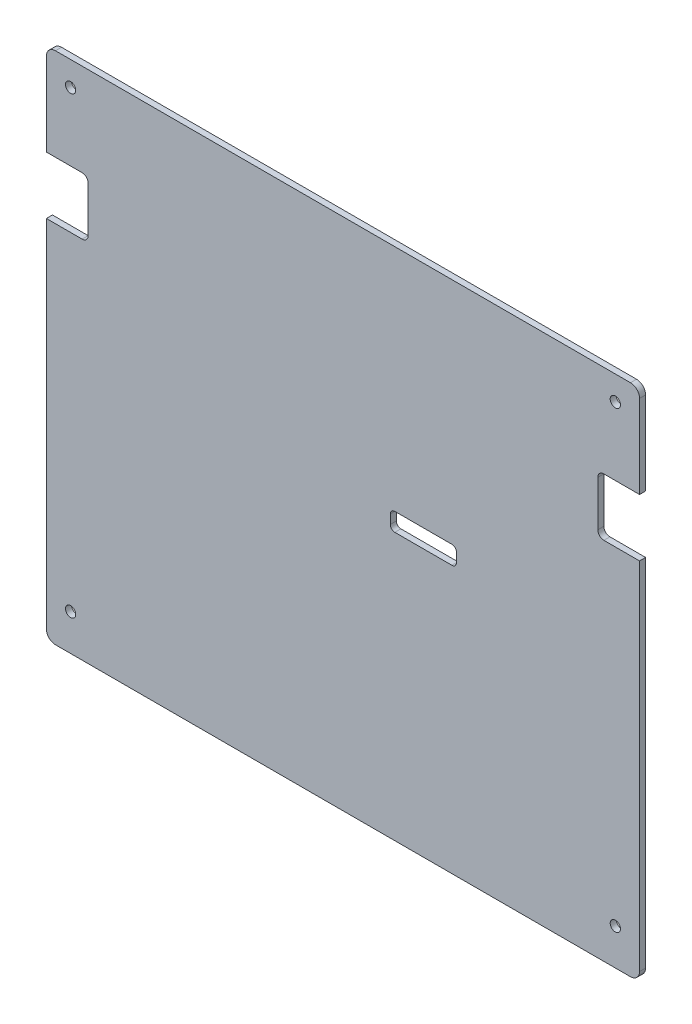
ISO-10303-21;
HEADER;
FILE_DESCRIPTION(('STEP AP214'),'2;1');
FILE_NAME('part.step','',(''),(''),'','','');
FILE_SCHEMA(('AUTOMOTIVE_DESIGN { 1 0 10303 214 1 1 1 1 }'));
ENDSEC;
DATA;
#1=APPLICATION_CONTEXT('core data for automotive mechanical design processes');
#2=APPLICATION_PROTOCOL_DEFINITION('international standard','automotive_design',2000,#1);
#3=PRODUCT_CONTEXT('',#1,'mechanical');
#4=PRODUCT('Part','Part','',(#3));
#5=PRODUCT_RELATED_PRODUCT_CATEGORY('part','',(#4));
#6=PRODUCT_DEFINITION_FORMATION('','',#4);
#7=PRODUCT_DEFINITION_CONTEXT('part definition',#1,'design');
#8=PRODUCT_DEFINITION('design','',#6,#7);
#9=PRODUCT_DEFINITION_SHAPE('','',#8);
#10=(LENGTH_UNIT() NAMED_UNIT(*) SI_UNIT(.MILLI.,.METRE.));
#11=(NAMED_UNIT(*) PLANE_ANGLE_UNIT() SI_UNIT($,.RADIAN.));
#12=(NAMED_UNIT(*) SI_UNIT($,.STERADIAN.) SOLID_ANGLE_UNIT());
#13=UNCERTAINTY_MEASURE_WITH_UNIT(LENGTH_MEASURE(1.E-05),#10,'distance_accuracy_value','');
#14=(GEOMETRIC_REPRESENTATION_CONTEXT(3) GLOBAL_UNCERTAINTY_ASSIGNED_CONTEXT((#13)) GLOBAL_UNIT_ASSIGNED_CONTEXT((#10,
#11,#12)) REPRESENTATION_CONTEXT('',''));
#15=CARTESIAN_POINT('',(0.,0.,0.));
#16=DIRECTION('',(0.,0.,1.));
#17=DIRECTION('',(1.,0.,0.));
#18=AXIS2_PLACEMENT_3D('',#15,#16,#17);
#19=CARTESIAN_POINT('',(193.,-4.,-10.));
#20=DIRECTION('',(-1.,0.,0.));
#21=DIRECTION('',(0.,0.,1.));
#22=AXIS2_PLACEMENT_3D('',#19,#20,#21);
#23=PLANE('',#22);
#24=DIRECTION('',(0.,1.,0.));
#25=VECTOR('',#24,1.);
#26=CARTESIAN_POINT('',(193.,-4.,-10.));
#27=LINE('',#26,#25);
#28=CARTESIAN_POINT('',(193.,132.5,-10.));
#29=VERTEX_POINT('',#28);
#30=CARTESIAN_POINT('',(193.,160.,-10.));
#31=VERTEX_POINT('',#30);
#32=EDGE_CURVE('E412',#29,#31,#27,.T.);
#33=ORIENTED_EDGE('',*,*,#32,.F.);
#34=DIRECTION('',(0.,0.,-1.));
#35=VECTOR('',#34,1.);
#36=CARTESIAN_POINT('',(193.,132.5,-10.));
#37=LINE('',#36,#35);
#38=CARTESIAN_POINT('',(193.,132.5,-12.));
#39=VERTEX_POINT('',#38);
#40=EDGE_CURVE('E471',#29,#39,#37,.T.);
#41=ORIENTED_EDGE('',*,*,#40,.T.);
#42=DIRECTION('',(0.,1.,0.));
#43=VECTOR('',#42,1.);
#44=CARTESIAN_POINT('',(193.,-4.,-12.));
#45=LINE('',#44,#43);
#46=CARTESIAN_POINT('',(193.,160.,-12.));
#47=VERTEX_POINT('',#46);
#48=EDGE_CURVE('E384',#39,#47,#45,.T.);
#49=ORIENTED_EDGE('',*,*,#48,.T.);
#50=DIRECTION('',(0.,0.,-1.));
#51=VECTOR('',#50,1.);
#52=CARTESIAN_POINT('',(193.,160.,-10.));
#53=LINE('',#52,#51);
#54=EDGE_CURVE('E344',#31,#47,#53,.T.);
#55=ORIENTED_EDGE('',*,*,#54,.F.);
#56=EDGE_LOOP('',(#33,#41,#49,#55));
#57=FACE_BOUND('',#56,.T.);
#58=ADVANCED_FACE('F45',(#57),#23,.F.);
#59=CARTESIAN_POINT('',(-3.,160.,-10.));
#60=DIRECTION('',(1.,0.,0.));
#61=DIRECTION('',(0.,0.,-1.));
#62=AXIS2_PLACEMENT_3D('',#59,#60,#61);
#63=PLANE('',#62);
#64=DIRECTION('',(0.,-1.,0.));
#65=VECTOR('',#64,1.);
#66=CARTESIAN_POINT('',(-3.,160.,-12.));
#67=LINE('',#66,#65);
#68=CARTESIAN_POINT('',(-3.,160.,-12.));
#69=VERTEX_POINT('',#68);
#70=CARTESIAN_POINT('',(-3.,132.5,-12.));
#71=VERTEX_POINT('',#70);
#72=EDGE_CURVE('E365',#69,#71,#67,.T.);
#73=ORIENTED_EDGE('',*,*,#72,.T.);
#74=DIRECTION('',(0.,0.,1.));
#75=VECTOR('',#74,1.);
#76=CARTESIAN_POINT('',(-3.,132.5,-10.));
#77=LINE('',#76,#75);
#78=CARTESIAN_POINT('',(-3.,132.5,-10.));
#79=VERTEX_POINT('',#78);
#80=EDGE_CURVE('E424',#71,#79,#77,.T.);
#81=ORIENTED_EDGE('',*,*,#80,.T.);
#82=DIRECTION('',(0.,-1.,0.));
#83=VECTOR('',#82,1.);
#84=CARTESIAN_POINT('',(-3.,160.,-10.));
#85=LINE('',#84,#83);
#86=CARTESIAN_POINT('',(-3.,160.,-10.));
#87=VERTEX_POINT('',#86);
#88=EDGE_CURVE('E364',#87,#79,#85,.T.);
#89=ORIENTED_EDGE('',*,*,#88,.F.);
#90=DIRECTION('',(0.,0.,-1.));
#91=VECTOR('',#90,1.);
#92=CARTESIAN_POINT('',(-3.,160.,-10.));
#93=LINE('',#92,#91);
#94=EDGE_CURVE('E356',#87,#69,#93,.T.);
#95=ORIENTED_EDGE('',*,*,#94,.T.);
#96=EDGE_LOOP('',(#73,#81,#89,#95));
#97=FACE_BOUND('',#96,.T.);
#98=ADVANCED_FACE('F589',(#97),#63,.F.);
#99=CARTESIAN_POINT('',(0.,-4.,-10.));
#100=DIRECTION('',(0.,0.,-1.));
#101=DIRECTION('',(-1.,0.,0.));
#102=AXIS2_PLACEMENT_3D('',#99,#100,#101);
#103=CYLINDRICAL_SURFACE('',#102,3.);
#104=CARTESIAN_POINT('',(0.,-4.,-12.));
#105=DIRECTION('',(0.,0.,1.));
#106=DIRECTION('',(1.,0.,0.));
#107=AXIS2_PLACEMENT_3D('',#104,#105,#106);
#108=CIRCLE('',#107,3.);
#109=CARTESIAN_POINT('',(-3.,-4.,-12.));
#110=VERTEX_POINT('',#109);
#111=CARTESIAN_POINT('',(0.,-7.,-12.));
#112=VERTEX_POINT('',#111);
#113=EDGE_CURVE('E391',#110,#112,#108,.T.);
#114=ORIENTED_EDGE('',*,*,#113,.T.);
#115=DIRECTION('',(0.,0.,-1.));
#116=VECTOR('',#115,1.);
#117=CARTESIAN_POINT('',(0.,-7.,-10.));
#118=LINE('',#117,#116);
#119=CARTESIAN_POINT('',(0.,-7.,-10.));
#120=VERTEX_POINT('',#119);
#121=EDGE_CURVE('E332',#120,#112,#118,.T.);
#122=ORIENTED_EDGE('',*,*,#121,.F.);
#123=CARTESIAN_POINT('',(0.,-4.,-10.));
#124=DIRECTION('',(0.,0.,1.));
#125=DIRECTION('',(1.,0.,0.));
#126=AXIS2_PLACEMENT_3D('',#123,#124,#125);
#127=CIRCLE('',#126,3.);
#128=CARTESIAN_POINT('',(-3.,-4.,-10.));
#129=VERTEX_POINT('',#128);
#130=EDGE_CURVE('E369',#129,#120,#127,.T.);
#131=ORIENTED_EDGE('',*,*,#130,.F.);
#132=DIRECTION('',(0.,0.,-1.));
#133=VECTOR('',#132,1.);
#134=CARTESIAN_POINT('',(-3.,-4.,-10.));
#135=LINE('',#134,#133);
#136=EDGE_CURVE('E360',#129,#110,#135,.T.);
#137=ORIENTED_EDGE('',*,*,#136,.T.);
#138=EDGE_LOOP('',(#114,#122,#131,#137));
#139=FACE_BOUND('',#138,.T.);
#140=ADVANCED_FACE('F47',(#139),#103,.T.);
#141=CARTESIAN_POINT('',(0.,-7.,-10.));
#142=DIRECTION('',(0.,1.,0.));
#143=DIRECTION('',(0.,0.,1.));
#144=AXIS2_PLACEMENT_3D('',#141,#142,#143);
#145=PLANE('',#144);
#146=DIRECTION('',(1.,0.,0.));
#147=VECTOR('',#146,1.);
#148=CARTESIAN_POINT('',(0.,-7.,-12.));
#149=LINE('',#148,#147);
#150=CARTESIAN_POINT('',(190.,-7.,-12.));
#151=VERTEX_POINT('',#150);
#152=EDGE_CURVE('E388',#112,#151,#149,.T.);
#153=ORIENTED_EDGE('',*,*,#152,.T.);
#154=DIRECTION('',(0.,0.,-1.));
#155=VECTOR('',#154,1.);
#156=CARTESIAN_POINT('',(190.,-7.,-10.));
#157=LINE('',#156,#155);
#158=CARTESIAN_POINT('',(190.,-7.,-10.));
#159=VERTEX_POINT('',#158);
#160=EDGE_CURVE('E336',#159,#151,#157,.T.);
#161=ORIENTED_EDGE('',*,*,#160,.F.);
#162=DIRECTION('',(1.,0.,0.));
#163=VECTOR('',#162,1.);
#164=CARTESIAN_POINT('',(0.,-7.,-10.));
#165=LINE('',#164,#163);
#166=EDGE_CURVE('E416',#120,#159,#165,.T.);
#167=ORIENTED_EDGE('',*,*,#166,.F.);
#168=ORIENTED_EDGE('',*,*,#121,.T.);
#169=EDGE_LOOP('',(#153,#161,#167,#168));
#170=FACE_BOUND('',#169,.T.);
#171=ADVANCED_FACE('F610',(#170),#145,.F.);
#172=CARTESIAN_POINT('',(190.,-4.,-10.));
#173=DIRECTION('',(0.,0.,-1.));
#174=DIRECTION('',(-1.,0.,0.));
#175=AXIS2_PLACEMENT_3D('',#172,#173,#174);
#176=CYLINDRICAL_SURFACE('',#175,3.);
#177=CARTESIAN_POINT('',(190.,-4.,-12.));
#178=DIRECTION('',(0.,0.,1.));
#179=DIRECTION('',(1.,0.,0.));
#180=AXIS2_PLACEMENT_3D('',#177,#178,#179);
#181=CIRCLE('',#180,3.);
#182=CARTESIAN_POINT('',(193.,-4.,-12.));
#183=VERTEX_POINT('',#182);
#184=EDGE_CURVE('E385',#151,#183,#181,.T.);
#185=ORIENTED_EDGE('',*,*,#184,.T.);
#186=DIRECTION('',(0.,0.,-1.));
#187=VECTOR('',#186,1.);
#188=CARTESIAN_POINT('',(193.,-4.,-10.));
#189=LINE('',#188,#187);
#190=CARTESIAN_POINT('',(193.,-4.,-10.));
#191=VERTEX_POINT('',#190);
#192=EDGE_CURVE('E340',#191,#183,#189,.T.);
#193=ORIENTED_EDGE('',*,*,#192,.F.);
#194=CARTESIAN_POINT('',(190.,-4.,-10.));
#195=DIRECTION('',(0.,0.,1.));
#196=DIRECTION('',(1.,0.,0.));
#197=AXIS2_PLACEMENT_3D('',#194,#195,#196);
#198=CIRCLE('',#197,3.);
#199=EDGE_CURVE('E413',#159,#191,#198,.T.);
#200=ORIENTED_EDGE('',*,*,#199,.F.);
#201=ORIENTED_EDGE('',*,*,#160,.T.);
#202=EDGE_LOOP('',(#185,#193,#200,#201));
#203=FACE_BOUND('',#202,.T.);
#204=ADVANCED_FACE('F603',(#203),#176,.T.);
#205=CARTESIAN_POINT('',(193.,113.5,-12.));
#206=VERTEX_POINT('',#205);
#207=EDGE_CURVE('E380',#183,#206,#45,.T.);
#208=ORIENTED_EDGE('',*,*,#207,.T.);
#209=DIRECTION('',(0.,0.,1.));
#210=VECTOR('',#209,1.);
#211=CARTESIAN_POINT('',(193.,113.5,-10.));
#212=LINE('',#211,#210);
#213=CARTESIAN_POINT('',(193.,113.5,-10.));
#214=VERTEX_POINT('',#213);
#215=EDGE_CURVE('E478',#206,#214,#212,.T.);
#216=ORIENTED_EDGE('',*,*,#215,.T.);
#217=EDGE_CURVE('E408',#191,#214,#27,.T.);
#218=ORIENTED_EDGE('',*,*,#217,.F.);
#219=ORIENTED_EDGE('',*,*,#192,.T.);
#220=EDGE_LOOP('',(#208,#216,#218,#219));
#221=FACE_BOUND('',#220,.T.);
#222=ADVANCED_FACE('F592',(#221),#23,.F.);
#223=CARTESIAN_POINT('',(190.,160.,-10.));
#224=DIRECTION('',(0.,0.,-1.));
#225=DIRECTION('',(-1.,0.,0.));
#226=AXIS2_PLACEMENT_3D('',#223,#224,#225);
#227=CYLINDRICAL_SURFACE('',#226,3.);
#228=CARTESIAN_POINT('',(190.,160.,-12.));
#229=DIRECTION('',(0.,0.,1.));
#230=DIRECTION('',(1.,0.,0.));
#231=AXIS2_PLACEMENT_3D('',#228,#229,#230);
#232=CIRCLE('',#231,3.);
#233=CARTESIAN_POINT('',(190.,163.,-12.));
#234=VERTEX_POINT('',#233);
#235=EDGE_CURVE('E377',#47,#234,#232,.T.);
#236=ORIENTED_EDGE('',*,*,#235,.T.);
#237=DIRECTION('',(0.,0.,-1.));
#238=VECTOR('',#237,1.);
#239=CARTESIAN_POINT('',(190.,163.,-10.));
#240=LINE('',#239,#238);
#241=CARTESIAN_POINT('',(190.,163.,-10.));
#242=VERTEX_POINT('',#241);
#243=EDGE_CURVE('E348',#242,#234,#240,.T.);
#244=ORIENTED_EDGE('',*,*,#243,.F.);
#245=CARTESIAN_POINT('',(190.,160.,-10.));
#246=DIRECTION('',(0.,0.,1.));
#247=DIRECTION('',(1.,0.,0.));
#248=AXIS2_PLACEMENT_3D('',#245,#246,#247);
#249=CIRCLE('',#248,3.);
#250=EDGE_CURVE('E405',#31,#242,#249,.T.);
#251=ORIENTED_EDGE('',*,*,#250,.F.);
#252=ORIENTED_EDGE('',*,*,#54,.T.);
#253=EDGE_LOOP('',(#236,#244,#251,#252));
#254=FACE_BOUND('',#253,.T.);
#255=ADVANCED_FACE('F602',(#254),#227,.T.);
#256=CARTESIAN_POINT('',(190.,163.,-10.));
#257=DIRECTION('',(0.,-1.,0.));
#258=DIRECTION('',(0.,0.,-1.));
#259=AXIS2_PLACEMENT_3D('',#256,#257,#258);
#260=PLANE('',#259);
#261=DIRECTION('',(-1.,0.,0.));
#262=VECTOR('',#261,1.);
#263=CARTESIAN_POINT('',(190.,163.,-12.));
#264=LINE('',#263,#262);
#265=CARTESIAN_POINT('',(0.,163.,-12.));
#266=VERTEX_POINT('',#265);
#267=EDGE_CURVE('E374',#234,#266,#264,.T.);
#268=ORIENTED_EDGE('',*,*,#267,.T.);
#269=DIRECTION('',(0.,0.,-1.));
#270=VECTOR('',#269,1.);
#271=CARTESIAN_POINT('',(0.,163.,-10.));
#272=LINE('',#271,#270);
#273=CARTESIAN_POINT('',(0.,163.,-10.));
#274=VERTEX_POINT('',#273);
#275=EDGE_CURVE('E352',#274,#266,#272,.T.);
#276=ORIENTED_EDGE('',*,*,#275,.F.);
#277=DIRECTION('',(-1.,0.,0.));
#278=VECTOR('',#277,1.);
#279=CARTESIAN_POINT('',(190.,163.,-10.));
#280=LINE('',#279,#278);
#281=EDGE_CURVE('E403',#242,#274,#280,.T.);
#282=ORIENTED_EDGE('',*,*,#281,.F.);
#283=ORIENTED_EDGE('',*,*,#243,.T.);
#284=EDGE_LOOP('',(#268,#276,#282,#283));
#285=FACE_BOUND('',#284,.T.);
#286=ADVANCED_FACE('F608',(#285),#260,.F.);
#287=CARTESIAN_POINT('',(0.,160.,-10.));
#288=DIRECTION('',(0.,0.,-1.));
#289=DIRECTION('',(-1.,0.,0.));
#290=AXIS2_PLACEMENT_3D('',#287,#288,#289);
#291=CYLINDRICAL_SURFACE('',#290,3.);
#292=CARTESIAN_POINT('',(0.,160.,-12.));
#293=DIRECTION('',(0.,0.,1.));
#294=DIRECTION('',(1.,0.,0.));
#295=AXIS2_PLACEMENT_3D('',#292,#293,#294);
#296=CIRCLE('',#295,3.);
#297=EDGE_CURVE('E371',#266,#69,#296,.T.);
#298=ORIENTED_EDGE('',*,*,#297,.T.);
#299=ORIENTED_EDGE('',*,*,#94,.F.);
#300=CARTESIAN_POINT('',(0.,160.,-10.));
#301=DIRECTION('',(0.,0.,1.));
#302=DIRECTION('',(1.,0.,0.));
#303=AXIS2_PLACEMENT_3D('',#300,#301,#302);
#304=CIRCLE('',#303,3.);
#305=EDGE_CURVE('E400',#274,#87,#304,.T.);
#306=ORIENTED_EDGE('',*,*,#305,.F.);
#307=ORIENTED_EDGE('',*,*,#275,.T.);
#308=EDGE_LOOP('',(#298,#299,#306,#307));
#309=FACE_BOUND('',#308,.T.);
#310=ADVANCED_FACE('F669',(#309),#291,.T.);
#311=CARTESIAN_POINT('',(-3.,113.5,-10.));
#312=VERTEX_POINT('',#311);
#313=EDGE_CURVE('E399',#312,#129,#85,.T.);
#314=ORIENTED_EDGE('',*,*,#313,.F.);
#315=DIRECTION('',(0.,0.,-1.));
#316=VECTOR('',#315,1.);
#317=CARTESIAN_POINT('',(-3.,113.5,-10.));
#318=LINE('',#317,#316);
#319=CARTESIAN_POINT('',(-3.,113.5,-12.));
#320=VERTEX_POINT('',#319);
#321=EDGE_CURVE('E440',#312,#320,#318,.T.);
#322=ORIENTED_EDGE('',*,*,#321,.T.);
#323=EDGE_CURVE('E370',#320,#110,#67,.T.);
#324=ORIENTED_EDGE('',*,*,#323,.T.);
#325=ORIENTED_EDGE('',*,*,#136,.F.);
#326=EDGE_LOOP('',(#314,#322,#324,#325));
#327=FACE_BOUND('',#326,.T.);
#328=ADVANCED_FACE('F597',(#327),#63,.F.);
#329=CARTESIAN_POINT('',(0.,-4.,-10.));
#330=DIRECTION('',(0.,0.,1.));
#331=DIRECTION('',(1.,0.,0.));
#332=AXIS2_PLACEMENT_3D('',#329,#330,#331);
#333=PLANE('',#332);
#334=CARTESIAN_POINT('',(112.12500058,82.74999704,-10.));
#335=DIRECTION('',(0.,0.,1.));
#336=DIRECTION('',(1.,0.,0.));
#337=AXIS2_PLACEMENT_3D('',#334,#335,#336);
#338=CIRCLE('',#337,1.5);
#339=CARTESIAN_POINT('',(110.62500058,82.74999704,-10.));
#340=VERTEX_POINT('',#339);
#341=CARTESIAN_POINT('',(112.12500058,81.24999704,-10.));
#342=VERTEX_POINT('',#341);
#343=EDGE_CURVE('E241',#340,#342,#338,.T.);
#344=ORIENTED_EDGE('',*,*,#343,.F.);
#345=DIRECTION('',(0.,-1.,0.));
#346=VECTOR('',#345,1.);
#347=CARTESIAN_POINT('',(110.62500058,-4.,-10.));
#348=LINE('',#347,#346);
#349=CARTESIAN_POINT('',(110.62500058,85.74999974,-10.));
#350=VERTEX_POINT('',#349);
#351=EDGE_CURVE('E512',#350,#340,#348,.T.);
#352=ORIENTED_EDGE('',*,*,#351,.F.);
#353=CARTESIAN_POINT('',(112.12500058,85.74999974,-10.));
#354=DIRECTION('',(0.,0.,1.));
#355=DIRECTION('',(1.,0.,0.));
#356=AXIS2_PLACEMENT_3D('',#353,#354,#355);
#357=CIRCLE('',#356,1.5);
#358=CARTESIAN_POINT('',(112.12500058,87.24999974,-10.));
#359=VERTEX_POINT('',#358);
#360=EDGE_CURVE('E515',#359,#350,#357,.T.);
#361=ORIENTED_EDGE('',*,*,#360,.F.);
#362=DIRECTION('',(-1.,0.,0.));
#363=VECTOR('',#362,1.);
#364=CARTESIAN_POINT('',(0.,87.24999974,-10.));
#365=LINE('',#364,#363);
#366=CARTESIAN_POINT('',(130.9999982,87.24999974,-10.));
#367=VERTEX_POINT('',#366);
#368=EDGE_CURVE('E518',#367,#359,#365,.T.);
#369=ORIENTED_EDGE('',*,*,#368,.F.);
#370=CARTESIAN_POINT('',(130.9999982,85.74999974,-10.));
#371=DIRECTION('',(0.,0.,1.));
#372=DIRECTION('',(1.,0.,0.));
#373=AXIS2_PLACEMENT_3D('',#370,#371,#372);
#374=CIRCLE('',#373,1.5);
#375=CARTESIAN_POINT('',(132.4999982,85.74999974,-10.));
#376=VERTEX_POINT('',#375);
#377=EDGE_CURVE('E521',#376,#367,#374,.T.);
#378=ORIENTED_EDGE('',*,*,#377,.F.);
#379=DIRECTION('',(0.,1.,0.));
#380=VECTOR('',#379,1.);
#381=CARTESIAN_POINT('',(132.4999982,-4.,-10.));
#382=LINE('',#381,#380);
#383=CARTESIAN_POINT('',(132.4999982,82.74999704,-10.));
#384=VERTEX_POINT('',#383);
#385=EDGE_CURVE('E524',#384,#376,#382,.T.);
#386=ORIENTED_EDGE('',*,*,#385,.F.);
#387=CARTESIAN_POINT('',(130.9999982,82.74999704,-10.));
#388=DIRECTION('',(0.,0.,1.));
#389=DIRECTION('',(1.,0.,0.));
#390=AXIS2_PLACEMENT_3D('',#387,#388,#389);
#391=CIRCLE('',#390,1.5);
#392=CARTESIAN_POINT('',(130.9999982,81.24999704,-10.));
#393=VERTEX_POINT('',#392);
#394=EDGE_CURVE('E527',#393,#384,#391,.T.);
#395=ORIENTED_EDGE('',*,*,#394,.F.);
#396=DIRECTION('',(1.,0.,0.));
#397=VECTOR('',#396,1.);
#398=CARTESIAN_POINT('',(0.,81.24999704,-10.));
#399=LINE('',#398,#397);
#400=EDGE_CURVE('E530',#342,#393,#399,.T.);
#401=ORIENTED_EDGE('',*,*,#400,.F.);
#402=EDGE_LOOP('',(#344,#352,#361,#369,#378,#386,#395,#401));
#403=FACE_BOUND('',#402,.T.);
#404=CARTESIAN_POINT('',(185.,155.,-10.));
#405=DIRECTION('',(0.,0.,1.));
#406=DIRECTION('',(1.,0.,0.));
#407=AXIS2_PLACEMENT_3D('',#404,#405,#406);
#408=CIRCLE('',#407,1.70000000000001);
#409=CARTESIAN_POINT('',(186.7,155.,-10.));
#410=VERTEX_POINT('',#409);
#411=EDGE_CURVE('E277',#410,#410,#408,.T.);
#412=ORIENTED_EDGE('',*,*,#411,.F.);
#413=EDGE_LOOP('',(#412));
#414=FACE_BOUND('',#413,.T.);
#415=CARTESIAN_POINT('',(5.,155.,-10.));
#416=DIRECTION('',(0.,0.,1.));
#417=DIRECTION('',(1.,0.,0.));
#418=AXIS2_PLACEMENT_3D('',#415,#416,#417);
#419=CIRCLE('',#418,1.7);
#420=CARTESIAN_POINT('',(6.7,155.,-10.));
#421=VERTEX_POINT('',#420);
#422=EDGE_CURVE('E282',#421,#421,#419,.T.);
#423=ORIENTED_EDGE('',*,*,#422,.F.);
#424=EDGE_LOOP('',(#423));
#425=FACE_BOUND('',#424,.T.);
#426=CARTESIAN_POINT('',(185.,5.,-10.));
#427=DIRECTION('',(0.,0.,1.));
#428=DIRECTION('',(1.,0.,0.));
#429=AXIS2_PLACEMENT_3D('',#426,#427,#428);
#430=CIRCLE('',#429,1.70000000000001);
#431=CARTESIAN_POINT('',(186.7,5.,-10.));
#432=VERTEX_POINT('',#431);
#433=EDGE_CURVE('E287',#432,#432,#430,.T.);
#434=ORIENTED_EDGE('',*,*,#433,.F.);
#435=EDGE_LOOP('',(#434));
#436=FACE_BOUND('',#435,.T.);
#437=CARTESIAN_POINT('',(5.,5.,-10.));
#438=DIRECTION('',(0.,0.,1.));
#439=DIRECTION('',(1.,0.,0.));
#440=AXIS2_PLACEMENT_3D('',#437,#438,#439);
#441=CIRCLE('',#440,1.7);
#442=CARTESIAN_POINT('',(6.7,5.,-10.));
#443=VERTEX_POINT('',#442);
#444=EDGE_CURVE('E292',#443,#443,#441,.T.);
#445=ORIENTED_EDGE('',*,*,#444,.F.);
#446=EDGE_LOOP('',(#445));
#447=FACE_BOUND('',#446,.T.);
#448=DIRECTION('',(-1.,0.,0.));
#449=VECTOR('',#448,1.);
#450=CARTESIAN_POINT('',(0.,132.5,-10.));
#451=LINE('',#450,#449);
#452=CARTESIAN_POINT('',(181.2,132.5,-10.));
#453=VERTEX_POINT('',#452);
#454=EDGE_CURVE('E468',#29,#453,#451,.T.);
#455=ORIENTED_EDGE('',*,*,#454,.F.);
#456=ORIENTED_EDGE('',*,*,#32,.T.);
#457=ORIENTED_EDGE('',*,*,#250,.T.);
#458=ORIENTED_EDGE('',*,*,#281,.T.);
#459=ORIENTED_EDGE('',*,*,#305,.T.);
#460=ORIENTED_EDGE('',*,*,#88,.T.);
#461=DIRECTION('',(-1.,0.,0.));
#462=VECTOR('',#461,1.);
#463=CARTESIAN_POINT('',(0.,132.5,-10.));
#464=LINE('',#463,#462);
#465=CARTESIAN_POINT('',(8.8,132.5,-10.));
#466=VERTEX_POINT('',#465);
#467=EDGE_CURVE('E395',#466,#79,#464,.T.);
#468=ORIENTED_EDGE('',*,*,#467,.F.);
#469=CARTESIAN_POINT('',(8.8,130.5,-10.));
#470=DIRECTION('',(0.,0.,1.));
#471=DIRECTION('',(1.,0.,0.));
#472=AXIS2_PLACEMENT_3D('',#469,#470,#471);
#473=CIRCLE('',#472,2.);
#474=CARTESIAN_POINT('',(10.8,130.5,-10.));
#475=VERTEX_POINT('',#474);
#476=EDGE_CURVE('E428',#475,#466,#473,.T.);
#477=ORIENTED_EDGE('',*,*,#476,.F.);
#478=DIRECTION('',(0.,1.,0.));
#479=VECTOR('',#478,1.);
#480=CARTESIAN_POINT('',(10.8,-4.,-10.));
#481=LINE('',#480,#479);
#482=CARTESIAN_POINT('',(10.8,115.5,-10.));
#483=VERTEX_POINT('',#482);
#484=EDGE_CURVE('E431',#483,#475,#481,.T.);
#485=ORIENTED_EDGE('',*,*,#484,.F.);
#486=CARTESIAN_POINT('',(8.8,115.5,-10.));
#487=DIRECTION('',(0.,0.,1.));
#488=DIRECTION('',(1.,0.,0.));
#489=AXIS2_PLACEMENT_3D('',#486,#487,#488);
#490=CIRCLE('',#489,2.);
#491=CARTESIAN_POINT('',(8.8,113.5,-10.));
#492=VERTEX_POINT('',#491);
#493=EDGE_CURVE('E434',#492,#483,#490,.T.);
#494=ORIENTED_EDGE('',*,*,#493,.F.);
#495=DIRECTION('',(1.,0.,0.));
#496=VECTOR('',#495,1.);
#497=CARTESIAN_POINT('',(0.,113.5,-10.));
#498=LINE('',#497,#496);
#499=EDGE_CURVE('E437',#312,#492,#498,.T.);
#500=ORIENTED_EDGE('',*,*,#499,.F.);
#501=ORIENTED_EDGE('',*,*,#313,.T.);
#502=ORIENTED_EDGE('',*,*,#130,.T.);
#503=ORIENTED_EDGE('',*,*,#166,.T.);
#504=ORIENTED_EDGE('',*,*,#199,.T.);
#505=ORIENTED_EDGE('',*,*,#217,.T.);
#506=DIRECTION('',(1.,0.,0.));
#507=VECTOR('',#506,1.);
#508=CARTESIAN_POINT('',(0.,113.5,-10.));
#509=LINE('',#508,#507);
#510=CARTESIAN_POINT('',(181.2,113.5,-10.));
#511=VERTEX_POINT('',#510);
#512=EDGE_CURVE('E475',#511,#214,#509,.T.);
#513=ORIENTED_EDGE('',*,*,#512,.F.);
#514=CARTESIAN_POINT('',(181.2,115.5,-10.));
#515=DIRECTION('',(0.,0.,1.));
#516=DIRECTION('',(1.,0.,0.));
#517=AXIS2_PLACEMENT_3D('',#514,#515,#516);
#518=CIRCLE('',#517,2.);
#519=CARTESIAN_POINT('',(179.2,115.5,-10.));
#520=VERTEX_POINT('',#519);
#521=EDGE_CURVE('E450',#520,#511,#518,.T.);
#522=ORIENTED_EDGE('',*,*,#521,.F.);
#523=DIRECTION('',(0.,-1.,0.));
#524=VECTOR('',#523,1.);
#525=CARTESIAN_POINT('',(179.2,-4.,-10.));
#526=LINE('',#525,#524);
#527=CARTESIAN_POINT('',(179.2,130.5,-10.));
#528=VERTEX_POINT('',#527);
#529=EDGE_CURVE('E462',#528,#520,#526,.T.);
#530=ORIENTED_EDGE('',*,*,#529,.F.);
#531=CARTESIAN_POINT('',(181.2,130.5,-10.));
#532=DIRECTION('',(0.,0.,1.));
#533=DIRECTION('',(1.,0.,0.));
#534=AXIS2_PLACEMENT_3D('',#531,#532,#533);
#535=CIRCLE('',#534,2.);
#536=EDGE_CURVE('E465',#453,#528,#535,.T.);
#537=ORIENTED_EDGE('',*,*,#536,.F.);
#538=EDGE_LOOP('',(#455,#456,#457,#458,#459,#460,#468,#477,#485,#494,#500,#501,#502,#503,#504,
#505,#513,#522,#530,#537));
#539=FACE_BOUND('',#538,.T.);
#540=ADVANCED_FACE('F558',(#403,#414,#425,#436,#447,#539),#333,.T.);
#541=CARTESIAN_POINT('',(0.,-4.,-12.));
#542=DIRECTION('',(0.,0.,1.));
#543=DIRECTION('',(1.,0.,0.));
#544=AXIS2_PLACEMENT_3D('',#541,#542,#543);
#545=PLANE('',#544);
#546=DIRECTION('',(0.,-1.,0.));
#547=VECTOR('',#546,1.);
#548=CARTESIAN_POINT('',(110.62500058,-4.,-12.));
#549=LINE('',#548,#547);
#550=CARTESIAN_POINT('',(110.62500058,85.74999974,-12.));
#551=VERTEX_POINT('',#550);
#552=CARTESIAN_POINT('',(110.62500058,82.74999704,-12.));
#553=VERTEX_POINT('',#552);
#554=EDGE_CURVE('E54',#551,#553,#549,.T.);
#555=ORIENTED_EDGE('',*,*,#554,.T.);
#556=CARTESIAN_POINT('',(112.12500058,82.74999704,-12.));
#557=DIRECTION('',(0.,0.,1.));
#558=DIRECTION('',(1.,0.,0.));
#559=AXIS2_PLACEMENT_3D('',#556,#557,#558);
#560=CIRCLE('',#559,1.5);
#561=CARTESIAN_POINT('',(112.12500058,81.24999704,-12.));
#562=VERTEX_POINT('',#561);
#563=EDGE_CURVE('E11',#553,#562,#560,.T.);
#564=ORIENTED_EDGE('',*,*,#563,.T.);
#565=DIRECTION('',(1.,0.,0.));
#566=VECTOR('',#565,1.);
#567=CARTESIAN_POINT('',(0.,81.24999704,-12.));
#568=LINE('',#567,#566);
#569=CARTESIAN_POINT('',(130.9999982,81.24999704,-12.));
#570=VERTEX_POINT('',#569);
#571=EDGE_CURVE('E228',#562,#570,#568,.T.);
#572=ORIENTED_EDGE('',*,*,#571,.T.);
#573=CARTESIAN_POINT('',(130.9999982,82.74999704,-12.));
#574=DIRECTION('',(0.,0.,1.));
#575=DIRECTION('',(1.,0.,0.));
#576=AXIS2_PLACEMENT_3D('',#573,#574,#575);
#577=CIRCLE('',#576,1.5);
#578=CARTESIAN_POINT('',(132.4999982,82.74999704,-12.));
#579=VERTEX_POINT('',#578);
#580=EDGE_CURVE('E233',#570,#579,#577,.T.);
#581=ORIENTED_EDGE('',*,*,#580,.T.);
#582=DIRECTION('',(0.,1.,0.));
#583=VECTOR('',#582,1.);
#584=CARTESIAN_POINT('',(132.4999982,-4.,-12.));
#585=LINE('',#584,#583);
#586=CARTESIAN_POINT('',(132.4999982,85.74999974,-12.));
#587=VERTEX_POINT('',#586);
#588=EDGE_CURVE('E267',#579,#587,#585,.T.);
#589=ORIENTED_EDGE('',*,*,#588,.T.);
#590=CARTESIAN_POINT('',(130.9999982,85.74999974,-12.));
#591=DIRECTION('',(0.,0.,1.));
#592=DIRECTION('',(1.,0.,0.));
#593=AXIS2_PLACEMENT_3D('',#590,#591,#592);
#594=CIRCLE('',#593,1.5);
#595=CARTESIAN_POINT('',(130.9999982,87.24999974,-12.));
#596=VERTEX_POINT('',#595);
#597=EDGE_CURVE('E263',#587,#596,#594,.T.);
#598=ORIENTED_EDGE('',*,*,#597,.T.);
#599=DIRECTION('',(-1.,0.,0.));
#600=VECTOR('',#599,1.);
#601=CARTESIAN_POINT('',(0.,87.24999974,-12.));
#602=LINE('',#601,#600);
#603=CARTESIAN_POINT('',(112.12500058,87.24999974,-12.));
#604=VERTEX_POINT('',#603);
#605=EDGE_CURVE('E258',#596,#604,#602,.T.);
#606=ORIENTED_EDGE('',*,*,#605,.T.);
#607=CARTESIAN_POINT('',(112.12500058,85.74999974,-12.));
#608=DIRECTION('',(0.,0.,1.));
#609=DIRECTION('',(1.,0.,0.));
#610=AXIS2_PLACEMENT_3D('',#607,#608,#609);
#611=CIRCLE('',#610,1.5);
#612=EDGE_CURVE('E250',#604,#551,#611,.T.);
#613=ORIENTED_EDGE('',*,*,#612,.T.);
#614=EDGE_LOOP('',(#555,#564,#572,#581,#589,#598,#606,#613));
#615=FACE_BOUND('',#614,.T.);
#616=CARTESIAN_POINT('',(185.,155.,-12.));
#617=DIRECTION('',(0.,0.,1.));
#618=DIRECTION('',(1.,0.,0.));
#619=AXIS2_PLACEMENT_3D('',#616,#617,#618);
#620=CIRCLE('',#619,1.70000000000001);
#621=CARTESIAN_POINT('',(186.7,155.,-12.));
#622=VERTEX_POINT('',#621);
#623=EDGE_CURVE('E273',#622,#622,#620,.T.);
#624=ORIENTED_EDGE('',*,*,#623,.T.);
#625=EDGE_LOOP('',(#624));
#626=FACE_BOUND('',#625,.T.);
#627=CARTESIAN_POINT('',(5.,155.,-12.));
#628=DIRECTION('',(0.,0.,1.));
#629=DIRECTION('',(1.,0.,0.));
#630=AXIS2_PLACEMENT_3D('',#627,#628,#629);
#631=CIRCLE('',#630,1.7);
#632=CARTESIAN_POINT('',(6.7,155.,-12.));
#633=VERTEX_POINT('',#632);
#634=EDGE_CURVE('E278',#633,#633,#631,.T.);
#635=ORIENTED_EDGE('',*,*,#634,.T.);
#636=EDGE_LOOP('',(#635));
#637=FACE_BOUND('',#636,.T.);
#638=CARTESIAN_POINT('',(185.,5.,-12.));
#639=DIRECTION('',(0.,0.,1.));
#640=DIRECTION('',(1.,0.,0.));
#641=AXIS2_PLACEMENT_3D('',#638,#639,#640);
#642=CIRCLE('',#641,1.70000000000001);
#643=CARTESIAN_POINT('',(186.7,5.,-12.));
#644=VERTEX_POINT('',#643);
#645=EDGE_CURVE('E283',#644,#644,#642,.T.);
#646=ORIENTED_EDGE('',*,*,#645,.T.);
#647=EDGE_LOOP('',(#646));
#648=FACE_BOUND('',#647,.T.);
#649=CARTESIAN_POINT('',(5.,5.,-12.));
#650=DIRECTION('',(0.,0.,1.));
#651=DIRECTION('',(1.,0.,0.));
#652=AXIS2_PLACEMENT_3D('',#649,#650,#651);
#653=CIRCLE('',#652,1.7);
#654=CARTESIAN_POINT('',(6.7,5.,-12.));
#655=VERTEX_POINT('',#654);
#656=EDGE_CURVE('E288',#655,#655,#653,.T.);
#657=ORIENTED_EDGE('',*,*,#656,.T.);
#658=EDGE_LOOP('',(#657));
#659=FACE_BOUND('',#658,.T.);
#660=ORIENTED_EDGE('',*,*,#48,.F.);
#661=DIRECTION('',(-1.,0.,0.));
#662=VECTOR('',#661,1.);
#663=CARTESIAN_POINT('',(0.,132.5,-12.));
#664=LINE('',#663,#662);
#665=CARTESIAN_POINT('',(181.2,132.5,-12.));
#666=VERTEX_POINT('',#665);
#667=EDGE_CURVE('E234',#39,#666,#664,.T.);
#668=ORIENTED_EDGE('',*,*,#667,.T.);
#669=CARTESIAN_POINT('',(181.2,130.5,-12.));
#670=DIRECTION('',(0.,0.,1.));
#671=DIRECTION('',(1.,0.,0.));
#672=AXIS2_PLACEMENT_3D('',#669,#670,#671);
#673=CIRCLE('',#672,2.);
#674=CARTESIAN_POINT('',(179.2,130.5,-12.));
#675=VERTEX_POINT('',#674);
#676=EDGE_CURVE('E296',#666,#675,#673,.T.);
#677=ORIENTED_EDGE('',*,*,#676,.T.);
#678=DIRECTION('',(0.,-1.,0.));
#679=VECTOR('',#678,1.);
#680=CARTESIAN_POINT('',(179.2,-4.,-12.));
#681=LINE('',#680,#679);
#682=CARTESIAN_POINT('',(179.2,115.5,-12.));
#683=VERTEX_POINT('',#682);
#684=EDGE_CURVE('E300',#675,#683,#681,.T.);
#685=ORIENTED_EDGE('',*,*,#684,.T.);
#686=CARTESIAN_POINT('',(181.2,115.5,-12.));
#687=DIRECTION('',(0.,0.,1.));
#688=DIRECTION('',(1.,0.,0.));
#689=AXIS2_PLACEMENT_3D('',#686,#687,#688);
#690=CIRCLE('',#689,2.);
#691=CARTESIAN_POINT('',(181.2,113.5,-12.));
#692=VERTEX_POINT('',#691);
#693=EDGE_CURVE('E304',#683,#692,#690,.T.);
#694=ORIENTED_EDGE('',*,*,#693,.T.);
#695=DIRECTION('',(1.,0.,0.));
#696=VECTOR('',#695,1.);
#697=CARTESIAN_POINT('',(0.,113.5,-12.));
#698=LINE('',#697,#696);
#699=EDGE_CURVE('E308',#692,#206,#698,.T.);
#700=ORIENTED_EDGE('',*,*,#699,.T.);
#701=ORIENTED_EDGE('',*,*,#207,.F.);
#702=ORIENTED_EDGE('',*,*,#184,.F.);
#703=ORIENTED_EDGE('',*,*,#152,.F.);
#704=ORIENTED_EDGE('',*,*,#113,.F.);
#705=ORIENTED_EDGE('',*,*,#323,.F.);
#706=DIRECTION('',(1.,0.,0.));
#707=VECTOR('',#706,1.);
#708=CARTESIAN_POINT('',(0.,113.5,-12.));
#709=LINE('',#708,#707);
#710=CARTESIAN_POINT('',(8.8,113.5,-12.));
#711=VERTEX_POINT('',#710);
#712=EDGE_CURVE('E328',#320,#711,#709,.T.);
#713=ORIENTED_EDGE('',*,*,#712,.T.);
#714=CARTESIAN_POINT('',(8.8,115.5,-12.));
#715=DIRECTION('',(0.,0.,1.));
#716=DIRECTION('',(1.,0.,0.));
#717=AXIS2_PLACEMENT_3D('',#714,#715,#716);
#718=CIRCLE('',#717,2.);
#719=CARTESIAN_POINT('',(10.8,115.5,-12.));
#720=VERTEX_POINT('',#719);
#721=EDGE_CURVE('E324',#711,#720,#718,.T.);
#722=ORIENTED_EDGE('',*,*,#721,.T.);
#723=DIRECTION('',(0.,1.,0.));
#724=VECTOR('',#723,1.);
#725=CARTESIAN_POINT('',(10.8,-4.,-12.));
#726=LINE('',#725,#724);
#727=CARTESIAN_POINT('',(10.8,130.5,-12.));
#728=VERTEX_POINT('',#727);
#729=EDGE_CURVE('E320',#720,#728,#726,.T.);
#730=ORIENTED_EDGE('',*,*,#729,.T.);
#731=CARTESIAN_POINT('',(8.8,130.5,-12.));
#732=DIRECTION('',(0.,0.,1.));
#733=DIRECTION('',(1.,0.,0.));
#734=AXIS2_PLACEMENT_3D('',#731,#732,#733);
#735=CIRCLE('',#734,2.);
#736=CARTESIAN_POINT('',(8.8,132.5,-12.));
#737=VERTEX_POINT('',#736);
#738=EDGE_CURVE('E316',#728,#737,#735,.T.);
#739=ORIENTED_EDGE('',*,*,#738,.T.);
#740=DIRECTION('',(-1.,0.,0.));
#741=VECTOR('',#740,1.);
#742=CARTESIAN_POINT('',(0.,132.5,-12.));
#743=LINE('',#742,#741);
#744=EDGE_CURVE('E312',#737,#71,#743,.T.);
#745=ORIENTED_EDGE('',*,*,#744,.T.);
#746=ORIENTED_EDGE('',*,*,#72,.F.);
#747=ORIENTED_EDGE('',*,*,#297,.F.);
#748=ORIENTED_EDGE('',*,*,#267,.F.);
#749=ORIENTED_EDGE('',*,*,#235,.F.);
#750=EDGE_LOOP('',(#660,#668,#677,#685,#694,#700,#701,#702,#703,#704,#705,#713,#722,#730,#739,
#745,#746,#747,#748,#749));
#751=FACE_BOUND('',#750,.T.);
#752=ADVANCED_FACE('F246',(#615,#626,#637,#648,#659,#751),#545,.F.);
#753=CARTESIAN_POINT('',(8.8,130.5,-12.2));
#754=DIRECTION('',(0.,0.,1.));
#755=DIRECTION('',(1.,0.,0.));
#756=AXIS2_PLACEMENT_3D('',#753,#754,#755);
#757=CYLINDRICAL_SURFACE('',#756,2.);
#758=ORIENTED_EDGE('',*,*,#476,.T.);
#759=DIRECTION('',(0.,0.,1.));
#760=VECTOR('',#759,1.);
#761=CARTESIAN_POINT('',(8.8,132.5,-12.2));
#762=LINE('',#761,#760);
#763=EDGE_CURVE('E444',#737,#466,#762,.T.);
#764=ORIENTED_EDGE('',*,*,#763,.F.);
#765=ORIENTED_EDGE('',*,*,#738,.F.);
#766=DIRECTION('',(0.,0.,1.));
#767=VECTOR('',#766,1.);
#768=CARTESIAN_POINT('',(10.8,130.5,-12.2));
#769=LINE('',#768,#767);
#770=EDGE_CURVE('E454',#728,#475,#769,.T.);
#771=ORIENTED_EDGE('',*,*,#770,.T.);
#772=EDGE_LOOP('',(#758,#764,#765,#771));
#773=FACE_BOUND('',#772,.T.);
#774=ADVANCED_FACE('F657',(#773),#757,.F.);
#775=CARTESIAN_POINT('',(10.8,115.5,-12.2));
#776=DIRECTION('',(1.,0.,0.));
#777=DIRECTION('',(0.,0.,-1.));
#778=AXIS2_PLACEMENT_3D('',#775,#776,#777);
#779=PLANE('',#778);
#780=ORIENTED_EDGE('',*,*,#484,.T.);
#781=ORIENTED_EDGE('',*,*,#770,.F.);
#782=ORIENTED_EDGE('',*,*,#729,.F.);
#783=DIRECTION('',(0.,0.,1.));
#784=VECTOR('',#783,1.);
#785=CARTESIAN_POINT('',(10.8,115.5,-12.2));
#786=LINE('',#785,#784);
#787=EDGE_CURVE('E449',#720,#483,#786,.T.);
#788=ORIENTED_EDGE('',*,*,#787,.T.);
#789=EDGE_LOOP('',(#780,#781,#782,#788));
#790=FACE_BOUND('',#789,.T.);
#791=ADVANCED_FACE('F654',(#790),#779,.F.);
#792=CARTESIAN_POINT('',(8.8,115.5,-12.2));
#793=DIRECTION('',(0.,0.,1.));
#794=DIRECTION('',(1.,0.,0.));
#795=AXIS2_PLACEMENT_3D('',#792,#793,#794);
#796=CYLINDRICAL_SURFACE('',#795,2.);
#797=ORIENTED_EDGE('',*,*,#493,.T.);
#798=ORIENTED_EDGE('',*,*,#787,.F.);
#799=ORIENTED_EDGE('',*,*,#721,.F.);
#800=DIRECTION('',(0.,0.,1.));
#801=VECTOR('',#800,1.);
#802=CARTESIAN_POINT('',(8.8,113.5,-12.2));
#803=LINE('',#802,#801);
#804=EDGE_CURVE('E445',#711,#492,#803,.T.);
#805=ORIENTED_EDGE('',*,*,#804,.T.);
#806=EDGE_LOOP('',(#797,#798,#799,#805));
#807=FACE_BOUND('',#806,.T.);
#808=ADVANCED_FACE('F650',(#807),#796,.F.);
#809=CARTESIAN_POINT('',(8.8,132.5,-12.2));
#810=DIRECTION('',(0.,1.,0.));
#811=DIRECTION('',(0.,0.,1.));
#812=AXIS2_PLACEMENT_3D('',#809,#810,#811);
#813=PLANE('',#812);
#814=ORIENTED_EDGE('',*,*,#467,.T.);
#815=ORIENTED_EDGE('',*,*,#80,.F.);
#816=ORIENTED_EDGE('',*,*,#744,.F.);
#817=ORIENTED_EDGE('',*,*,#763,.T.);
#818=EDGE_LOOP('',(#814,#815,#816,#817));
#819=FACE_BOUND('',#818,.T.);
#820=ADVANCED_FACE('F662',(#819),#813,.F.);
#821=CARTESIAN_POINT('',(-4.,113.5,-12.2));
#822=DIRECTION('',(0.,-1.,0.));
#823=DIRECTION('',(0.,0.,-1.));
#824=AXIS2_PLACEMENT_3D('',#821,#822,#823);
#825=PLANE('',#824);
#826=ORIENTED_EDGE('',*,*,#499,.T.);
#827=ORIENTED_EDGE('',*,*,#804,.F.);
#828=ORIENTED_EDGE('',*,*,#712,.F.);
#829=ORIENTED_EDGE('',*,*,#321,.F.);
#830=EDGE_LOOP('',(#826,#827,#828,#829));
#831=FACE_BOUND('',#830,.T.);
#832=ADVANCED_FACE('F647',(#831),#825,.F.);
#833=CARTESIAN_POINT('',(181.2,115.5,-12.2));
#834=DIRECTION('',(0.,0.,1.));
#835=DIRECTION('',(1.,0.,0.));
#836=AXIS2_PLACEMENT_3D('',#833,#834,#835);
#837=CYLINDRICAL_SURFACE('',#836,2.);
#838=ORIENTED_EDGE('',*,*,#521,.T.);
#839=DIRECTION('',(0.,0.,1.));
#840=VECTOR('',#839,1.);
#841=CARTESIAN_POINT('',(181.2,113.5,-12.2));
#842=LINE('',#841,#840);
#843=EDGE_CURVE('E483',#692,#511,#842,.T.);
#844=ORIENTED_EDGE('',*,*,#843,.F.);
#845=ORIENTED_EDGE('',*,*,#693,.F.);
#846=DIRECTION('',(0.,0.,1.));
#847=VECTOR('',#846,1.);
#848=CARTESIAN_POINT('',(179.2,115.5,-12.2));
#849=LINE('',#848,#847);
#850=EDGE_CURVE('E482',#683,#520,#849,.T.);
#851=ORIENTED_EDGE('',*,*,#850,.T.);
#852=EDGE_LOOP('',(#838,#844,#845,#851));
#853=FACE_BOUND('',#852,.T.);
#854=ADVANCED_FACE('F623',(#853),#837,.F.);
#855=CARTESIAN_POINT('',(179.2,130.5,-12.2));
#856=DIRECTION('',(-1.,0.,0.));
#857=DIRECTION('',(0.,0.,1.));
#858=AXIS2_PLACEMENT_3D('',#855,#856,#857);
#859=PLANE('',#858);
#860=ORIENTED_EDGE('',*,*,#529,.T.);
#861=ORIENTED_EDGE('',*,*,#850,.F.);
#862=ORIENTED_EDGE('',*,*,#684,.F.);
#863=DIRECTION('',(0.,0.,1.));
#864=VECTOR('',#863,1.);
#865=CARTESIAN_POINT('',(179.2,130.5,-12.2));
#866=LINE('',#865,#864);
#867=EDGE_CURVE('E491',#675,#528,#866,.T.);
#868=ORIENTED_EDGE('',*,*,#867,.T.);
#869=EDGE_LOOP('',(#860,#861,#862,#868));
#870=FACE_BOUND('',#869,.T.);
#871=ADVANCED_FACE('F685',(#870),#859,.F.);
#872=CARTESIAN_POINT('',(181.2,130.5,-12.2));
#873=DIRECTION('',(0.,0.,1.));
#874=DIRECTION('',(1.,0.,0.));
#875=AXIS2_PLACEMENT_3D('',#872,#873,#874);
#876=CYLINDRICAL_SURFACE('',#875,2.);
#877=ORIENTED_EDGE('',*,*,#536,.T.);
#878=ORIENTED_EDGE('',*,*,#867,.F.);
#879=ORIENTED_EDGE('',*,*,#676,.F.);
#880=DIRECTION('',(0.,0.,1.));
#881=VECTOR('',#880,1.);
#882=CARTESIAN_POINT('',(181.2,132.5,-12.2));
#883=LINE('',#882,#881);
#884=EDGE_CURVE('E487',#666,#453,#883,.T.);
#885=ORIENTED_EDGE('',*,*,#884,.T.);
#886=EDGE_LOOP('',(#877,#878,#879,#885));
#887=FACE_BOUND('',#886,.T.);
#888=ADVANCED_FACE('F683',(#887),#876,.F.);
#889=CARTESIAN_POINT('',(194.,132.5,-12.2));
#890=DIRECTION('',(0.,1.,0.));
#891=DIRECTION('',(0.,0.,1.));
#892=AXIS2_PLACEMENT_3D('',#889,#890,#891);
#893=PLANE('',#892);
#894=ORIENTED_EDGE('',*,*,#454,.T.);
#895=ORIENTED_EDGE('',*,*,#884,.F.);
#896=ORIENTED_EDGE('',*,*,#667,.F.);
#897=ORIENTED_EDGE('',*,*,#40,.F.);
#898=EDGE_LOOP('',(#894,#895,#896,#897));
#899=FACE_BOUND('',#898,.T.);
#900=ADVANCED_FACE('F679',(#899),#893,.F.);
#901=CARTESIAN_POINT('',(181.2,113.5,-12.2));
#902=DIRECTION('',(0.,-1.,0.));
#903=DIRECTION('',(0.,0.,-1.));
#904=AXIS2_PLACEMENT_3D('',#901,#902,#903);
#905=PLANE('',#904);
#906=ORIENTED_EDGE('',*,*,#512,.T.);
#907=ORIENTED_EDGE('',*,*,#215,.F.);
#908=ORIENTED_EDGE('',*,*,#699,.F.);
#909=ORIENTED_EDGE('',*,*,#843,.T.);
#910=EDGE_LOOP('',(#906,#907,#908,#909));
#911=FACE_BOUND('',#910,.T.);
#912=ADVANCED_FACE('F620',(#911),#905,.F.);
#913=CARTESIAN_POINT('',(5.,5.,-12.2));
#914=DIRECTION('',(0.,0.,1.));
#915=DIRECTION('',(1.,0.,0.));
#916=AXIS2_PLACEMENT_3D('',#913,#914,#915);
#917=CYLINDRICAL_SURFACE('',#916,1.7);
#918=ORIENTED_EDGE('',*,*,#444,.T.);
#919=EDGE_LOOP('',(#918));
#920=FACE_BOUND('',#919,.T.);
#921=ORIENTED_EDGE('',*,*,#656,.F.);
#922=EDGE_LOOP('',(#921));
#923=FACE_BOUND('',#922,.T.);
#924=ADVANCED_FACE('F694',(#920,#923),#917,.F.);
#925=CARTESIAN_POINT('',(185.,5.,-12.2));
#926=DIRECTION('',(0.,0.,1.));
#927=DIRECTION('',(1.,0.,0.));
#928=AXIS2_PLACEMENT_3D('',#925,#926,#927);
#929=CYLINDRICAL_SURFACE('',#928,1.70000000000001);
#930=ORIENTED_EDGE('',*,*,#433,.T.);
#931=EDGE_LOOP('',(#930));
#932=FACE_BOUND('',#931,.T.);
#933=ORIENTED_EDGE('',*,*,#645,.F.);
#934=EDGE_LOOP('',(#933));
#935=FACE_BOUND('',#934,.T.);
#936=ADVANCED_FACE('F790',(#932,#935),#929,.F.);
#937=CARTESIAN_POINT('',(5.,155.,-12.2));
#938=DIRECTION('',(0.,0.,1.));
#939=DIRECTION('',(1.,0.,0.));
#940=AXIS2_PLACEMENT_3D('',#937,#938,#939);
#941=CYLINDRICAL_SURFACE('',#940,1.7);
#942=ORIENTED_EDGE('',*,*,#422,.T.);
#943=EDGE_LOOP('',(#942));
#944=FACE_BOUND('',#943,.T.);
#945=ORIENTED_EDGE('',*,*,#634,.F.);
#946=EDGE_LOOP('',(#945));
#947=FACE_BOUND('',#946,.T.);
#948=ADVANCED_FACE('F799',(#944,#947),#941,.F.);
#949=CARTESIAN_POINT('',(185.,155.,-12.2));
#950=DIRECTION('',(0.,0.,1.));
#951=DIRECTION('',(1.,0.,0.));
#952=AXIS2_PLACEMENT_3D('',#949,#950,#951);
#953=CYLINDRICAL_SURFACE('',#952,1.70000000000001);
#954=ORIENTED_EDGE('',*,*,#411,.T.);
#955=EDGE_LOOP('',(#954));
#956=FACE_BOUND('',#955,.T.);
#957=ORIENTED_EDGE('',*,*,#623,.F.);
#958=EDGE_LOOP('',(#957));
#959=FACE_BOUND('',#958,.T.);
#960=ADVANCED_FACE('F586',(#956,#959),#953,.F.);
#961=CARTESIAN_POINT('',(112.12500058,82.74999704,-12.2));
#962=DIRECTION('',(0.,0.,1.));
#963=DIRECTION('',(1.,0.,0.));
#964=AXIS2_PLACEMENT_3D('',#961,#962,#963);
#965=CYLINDRICAL_SURFACE('',#964,1.5);
#966=ORIENTED_EDGE('',*,*,#343,.T.);
#967=DIRECTION('',(0.,0.,1.));
#968=VECTOR('',#967,1.);
#969=CARTESIAN_POINT('',(112.12500058,81.24999704,-12.2));
#970=LINE('',#969,#968);
#971=EDGE_CURVE('E61',#562,#342,#970,.T.);
#972=ORIENTED_EDGE('',*,*,#971,.F.);
#973=ORIENTED_EDGE('',*,*,#563,.F.);
#974=DIRECTION('',(0.,0.,1.));
#975=VECTOR('',#974,1.);
#976=CARTESIAN_POINT('',(110.62500058,82.74999704,-12.2));
#977=LINE('',#976,#975);
#978=EDGE_CURVE('E532',#553,#340,#977,.T.);
#979=ORIENTED_EDGE('',*,*,#978,.T.);
#980=EDGE_LOOP('',(#966,#972,#973,#979));
#981=FACE_BOUND('',#980,.T.);
#982=ADVANCED_FACE('F237',(#981),#965,.F.);
#983=CARTESIAN_POINT('',(110.62500058,85.74999974,-12.2));
#984=DIRECTION('',(-1.,0.,0.));
#985=DIRECTION('',(0.,0.,1.));
#986=AXIS2_PLACEMENT_3D('',#983,#984,#985);
#987=PLANE('',#986);
#988=ORIENTED_EDGE('',*,*,#351,.T.);
#989=ORIENTED_EDGE('',*,*,#978,.F.);
#990=ORIENTED_EDGE('',*,*,#554,.F.);
#991=DIRECTION('',(0.,0.,1.));
#992=VECTOR('',#991,1.);
#993=CARTESIAN_POINT('',(110.62500058,85.74999974,-12.2));
#994=LINE('',#993,#992);
#995=EDGE_CURVE('E552',#551,#350,#994,.T.);
#996=ORIENTED_EDGE('',*,*,#995,.T.);
#997=EDGE_LOOP('',(#988,#989,#990,#996));
#998=FACE_BOUND('',#997,.T.);
#999=ADVANCED_FACE('F579',(#998),#987,.F.);
#1000=CARTESIAN_POINT('',(112.12500058,85.74999974,-12.2));
#1001=DIRECTION('',(0.,0.,1.));
#1002=DIRECTION('',(1.,0.,0.));
#1003=AXIS2_PLACEMENT_3D('',#1000,#1001,#1002);
#1004=CYLINDRICAL_SURFACE('',#1003,1.5);
#1005=ORIENTED_EDGE('',*,*,#360,.T.);
#1006=ORIENTED_EDGE('',*,*,#995,.F.);
#1007=ORIENTED_EDGE('',*,*,#612,.F.);
#1008=DIRECTION('',(0.,0.,1.));
#1009=VECTOR('',#1008,1.);
#1010=CARTESIAN_POINT('',(112.12500058,87.24999974,-12.2));
#1011=LINE('',#1010,#1009);
#1012=EDGE_CURVE('E548',#604,#359,#1011,.T.);
#1013=ORIENTED_EDGE('',*,*,#1012,.T.);
#1014=EDGE_LOOP('',(#1005,#1006,#1007,#1013));
#1015=FACE_BOUND('',#1014,.T.);
#1016=ADVANCED_FACE('F578',(#1015),#1004,.F.);
#1017=CARTESIAN_POINT('',(130.9999982,87.24999974,-12.2));
#1018=DIRECTION('',(0.,1.,0.));
#1019=DIRECTION('',(0.,0.,1.));
#1020=AXIS2_PLACEMENT_3D('',#1017,#1018,#1019);
#1021=PLANE('',#1020);
#1022=ORIENTED_EDGE('',*,*,#368,.T.);
#1023=ORIENTED_EDGE('',*,*,#1012,.F.);
#1024=ORIENTED_EDGE('',*,*,#605,.F.);
#1025=DIRECTION('',(0.,0.,1.));
#1026=VECTOR('',#1025,1.);
#1027=CARTESIAN_POINT('',(130.9999982,87.24999974,-12.2));
#1028=LINE('',#1027,#1026);
#1029=EDGE_CURVE('E544',#596,#367,#1028,.T.);
#1030=ORIENTED_EDGE('',*,*,#1029,.T.);
#1031=EDGE_LOOP('',(#1022,#1023,#1024,#1030));
#1032=FACE_BOUND('',#1031,.T.);
#1033=ADVANCED_FACE('F576',(#1032),#1021,.F.);
#1034=CARTESIAN_POINT('',(130.9999982,85.74999974,-12.2));
#1035=DIRECTION('',(0.,0.,1.));
#1036=DIRECTION('',(1.,0.,0.));
#1037=AXIS2_PLACEMENT_3D('',#1034,#1035,#1036);
#1038=CYLINDRICAL_SURFACE('',#1037,1.5);
#1039=ORIENTED_EDGE('',*,*,#377,.T.);
#1040=ORIENTED_EDGE('',*,*,#1029,.F.);
#1041=ORIENTED_EDGE('',*,*,#597,.F.);
#1042=DIRECTION('',(0.,0.,1.));
#1043=VECTOR('',#1042,1.);
#1044=CARTESIAN_POINT('',(132.4999982,85.74999974,-12.2));
#1045=LINE('',#1044,#1043);
#1046=EDGE_CURVE('E540',#587,#376,#1045,.T.);
#1047=ORIENTED_EDGE('',*,*,#1046,.T.);
#1048=EDGE_LOOP('',(#1039,#1040,#1041,#1047));
#1049=FACE_BOUND('',#1048,.T.);
#1050=ADVANCED_FACE('F571',(#1049),#1038,.F.);
#1051=CARTESIAN_POINT('',(132.4999982,82.74999704,-12.2));
#1052=DIRECTION('',(1.,0.,0.));
#1053=DIRECTION('',(0.,0.,-1.));
#1054=AXIS2_PLACEMENT_3D('',#1051,#1052,#1053);
#1055=PLANE('',#1054);
#1056=ORIENTED_EDGE('',*,*,#385,.T.);
#1057=ORIENTED_EDGE('',*,*,#1046,.F.);
#1058=ORIENTED_EDGE('',*,*,#588,.F.);
#1059=DIRECTION('',(0.,0.,1.));
#1060=VECTOR('',#1059,1.);
#1061=CARTESIAN_POINT('',(132.4999982,82.74999704,-12.2));
#1062=LINE('',#1061,#1060);
#1063=EDGE_CURVE('E536',#579,#384,#1062,.T.);
#1064=ORIENTED_EDGE('',*,*,#1063,.T.);
#1065=EDGE_LOOP('',(#1056,#1057,#1058,#1064));
#1066=FACE_BOUND('',#1065,.T.);
#1067=ADVANCED_FACE('F568',(#1066),#1055,.F.);
#1068=CARTESIAN_POINT('',(130.9999982,82.74999704,-12.2));
#1069=DIRECTION('',(0.,0.,1.));
#1070=DIRECTION('',(1.,0.,0.));
#1071=AXIS2_PLACEMENT_3D('',#1068,#1069,#1070);
#1072=CYLINDRICAL_SURFACE('',#1071,1.5);
#1073=ORIENTED_EDGE('',*,*,#394,.T.);
#1074=ORIENTED_EDGE('',*,*,#1063,.F.);
#1075=ORIENTED_EDGE('',*,*,#580,.F.);
#1076=DIRECTION('',(0.,0.,1.));
#1077=VECTOR('',#1076,1.);
#1078=CARTESIAN_POINT('',(130.9999982,81.24999704,-12.2));
#1079=LINE('',#1078,#1077);
#1080=EDGE_CURVE('E66',#570,#393,#1079,.T.);
#1081=ORIENTED_EDGE('',*,*,#1080,.T.);
#1082=EDGE_LOOP('',(#1073,#1074,#1075,#1081));
#1083=FACE_BOUND('',#1082,.T.);
#1084=ADVANCED_FACE('F564',(#1083),#1072,.F.);
#1085=CARTESIAN_POINT('',(112.12500058,81.24999704,-12.2));
#1086=DIRECTION('',(0.,-1.,0.));
#1087=DIRECTION('',(0.,0.,-1.));
#1088=AXIS2_PLACEMENT_3D('',#1085,#1086,#1087);
#1089=PLANE('',#1088);
#1090=ORIENTED_EDGE('',*,*,#400,.T.);
#1091=ORIENTED_EDGE('',*,*,#1080,.F.);
#1092=ORIENTED_EDGE('',*,*,#571,.F.);
#1093=ORIENTED_EDGE('',*,*,#971,.T.);
#1094=EDGE_LOOP('',(#1090,#1091,#1092,#1093));
#1095=FACE_BOUND('',#1094,.T.);
#1096=ADVANCED_FACE('F229',(#1095),#1089,.F.);
#1097=CLOSED_SHELL('',(#58,#98,#140,#171,#204,#222,#255,#286,#310,#328,#540,#752,#774,#791,#808,
#820,#832,#854,#871,#888,#900,#912,#924,#936,#948,#960,#982,#999,#1016,#1033,#1050,#1067,#1084,#1096));
#1098=MANIFOLD_SOLID_BREP('B2',#1097);
#1099=ADVANCED_BREP_SHAPE_REPRESENTATION('',(#18,#1098),#14);
#1100=SHAPE_DEFINITION_REPRESENTATION(#9,#1099);
ENDSEC;
END-ISO-10303-21;
